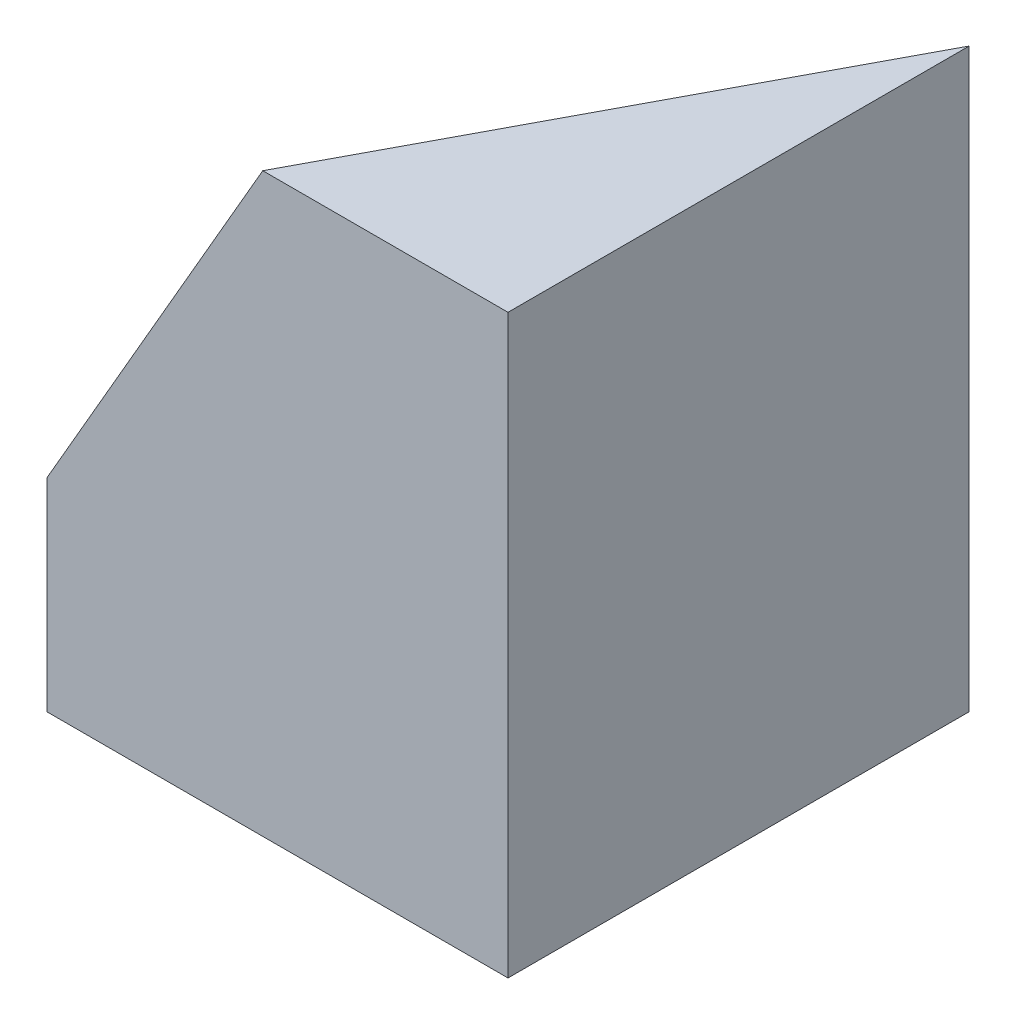
ISO-10303-21;
HEADER;
FILE_DESCRIPTION(('STEP AP214'),'2;1');
FILE_NAME('part.step','',(''),(''),'','','');
FILE_SCHEMA(('AUTOMOTIVE_DESIGN { 1 0 10303 214 1 1 1 1 }'));
ENDSEC;
DATA;
#1=APPLICATION_CONTEXT('core data for automotive mechanical design processes');
#2=APPLICATION_PROTOCOL_DEFINITION('international standard','automotive_design',2000,#1);
#3=PRODUCT_CONTEXT('',#1,'mechanical');
#4=PRODUCT('Part','Part','',(#3));
#5=PRODUCT_RELATED_PRODUCT_CATEGORY('part','',(#4));
#6=PRODUCT_DEFINITION_FORMATION('','',#4);
#7=PRODUCT_DEFINITION_CONTEXT('part definition',#1,'design');
#8=PRODUCT_DEFINITION('design','',#6,#7);
#9=PRODUCT_DEFINITION_SHAPE('','',#8);
#10=(LENGTH_UNIT() NAMED_UNIT(*) SI_UNIT(.MILLI.,.METRE.));
#11=(NAMED_UNIT(*) PLANE_ANGLE_UNIT() SI_UNIT($,.RADIAN.));
#12=(NAMED_UNIT(*) SI_UNIT($,.STERADIAN.) SOLID_ANGLE_UNIT());
#13=UNCERTAINTY_MEASURE_WITH_UNIT(LENGTH_MEASURE(1.E-05),#10,'distance_accuracy_value','');
#14=(GEOMETRIC_REPRESENTATION_CONTEXT(3) GLOBAL_UNCERTAINTY_ASSIGNED_CONTEXT((#13)) GLOBAL_UNIT_ASSIGNED_CONTEXT((#10,
#11,#12)) REPRESENTATION_CONTEXT('',''));
#15=CARTESIAN_POINT('',(0.,0.,0.));
#16=DIRECTION('',(0.,0.,1.));
#17=DIRECTION('',(1.,0.,0.));
#18=AXIS2_PLACEMENT_3D('',#15,#16,#17);
#19=CARTESIAN_POINT('',(24.,60.,24.));
#20=DIRECTION('',(-1.,0.,0.));
#21=DIRECTION('',(0.,0.,1.));
#22=AXIS2_PLACEMENT_3D('',#19,#20,#21);
#23=PLANE('',#22);
#24=DIRECTION('',(0.,0.,-1.));
#25=VECTOR('',#24,1.);
#26=CARTESIAN_POINT('',(24.,0.,24.));
#27=LINE('',#26,#25);
#28=CARTESIAN_POINT('',(24.,0.,24.));
#29=VERTEX_POINT('',#28);
#30=CARTESIAN_POINT('',(24.,0.,-24.));
#31=VERTEX_POINT('',#30);
#32=EDGE_CURVE('E104',#29,#31,#27,.T.);
#33=ORIENTED_EDGE('',*,*,#32,.T.);
#34=DIRECTION('',(0.,-1.,0.));
#35=VECTOR('',#34,1.);
#36=CARTESIAN_POINT('',(24.,60.,-24.));
#37=LINE('',#36,#35);
#38=CARTESIAN_POINT('',(24.,60.,-24.));
#39=VERTEX_POINT('',#38);
#40=EDGE_CURVE('E43',#39,#31,#37,.T.);
#41=ORIENTED_EDGE('',*,*,#40,.F.);
#42=DIRECTION('',(0.,0.,-1.));
#43=VECTOR('',#42,1.);
#44=CARTESIAN_POINT('',(24.,60.,24.));
#45=LINE('',#44,#43);
#46=CARTESIAN_POINT('',(24.,60.,24.));
#47=VERTEX_POINT('',#46);
#48=EDGE_CURVE('E105',#47,#39,#45,.T.);
#49=ORIENTED_EDGE('',*,*,#48,.F.);
#50=DIRECTION('',(0.,-1.,0.));
#51=VECTOR('',#50,1.);
#52=CARTESIAN_POINT('',(24.,60.,24.));
#53=LINE('',#52,#51);
#54=EDGE_CURVE('E109',#47,#29,#53,.T.);
#55=ORIENTED_EDGE('',*,*,#54,.T.);
#56=EDGE_LOOP('',(#33,#41,#49,#55));
#57=FACE_BOUND('',#56,.T.);
#58=ADVANCED_FACE('F36',(#57),#23,.F.);
#59=CARTESIAN_POINT('',(-24.,60.,-24.));
#60=DIRECTION('',(0.,0.,1.));
#61=DIRECTION('',(1.,0.,0.));
#62=AXIS2_PLACEMENT_3D('',#59,#60,#61);
#63=PLANE('',#62);
#64=DIRECTION('',(-1.,0.,0.));
#65=VECTOR('',#64,1.);
#66=CARTESIAN_POINT('',(-24.,0.,-24.));
#67=LINE('',#66,#65);
#68=CARTESIAN_POINT('',(-10.6410161513779,0.,-24.));
#69=VERTEX_POINT('',#68);
#70=EDGE_CURVE('E87',#31,#69,#67,.T.);
#71=ORIENTED_EDGE('',*,*,#70,.T.);
#72=DIRECTION('',(0.500000000000004,0.866025403784436,0.));
#73=VECTOR('',#72,1.);
#74=CARTESIAN_POINT('',(11.9999999999998,39.2153903091734,-24.));
#75=LINE('',#74,#73);
#76=EDGE_CURVE('E94',#69,#39,#75,.T.);
#77=ORIENTED_EDGE('',*,*,#76,.T.);
#78=ORIENTED_EDGE('',*,*,#40,.T.);
#79=EDGE_LOOP('',(#71,#77,#78));
#80=FACE_BOUND('',#79,.T.);
#81=ADVANCED_FACE('F117',(#80),#63,.F.);
#82=CARTESIAN_POINT('',(-24.,60.,24.));
#83=DIRECTION('',(1.,0.,0.));
#84=DIRECTION('',(0.,0.,-1.));
#85=AXIS2_PLACEMENT_3D('',#82,#83,#84);
#86=PLANE('',#85);
#87=DIRECTION('',(0.,-1.,0.));
#88=VECTOR('',#87,1.);
#89=CARTESIAN_POINT('',(-24.,60.,24.));
#90=LINE('',#89,#88);
#91=CARTESIAN_POINT('',(-24.,21.067053260755,24.));
#92=VERTEX_POINT('',#91);
#93=CARTESIAN_POINT('',(-24.,0.,24.));
#94=VERTEX_POINT('',#93);
#95=EDGE_CURVE('E92',#92,#94,#90,.T.);
#96=ORIENTED_EDGE('',*,*,#95,.F.);
#97=DIRECTION('',(0.,-0.677434014110465,-0.735583548297665));
#98=VECTOR('',#97,1.);
#99=CARTESIAN_POINT('',(-24.,38.9340382854635,43.4006500531479));
#100=LINE('',#99,#98);
#101=CARTESIAN_POINT('',(-24.,0.,1.12459447423744));
#102=VERTEX_POINT('',#101);
#103=EDGE_CURVE('E90',#92,#102,#100,.T.);
#104=ORIENTED_EDGE('',*,*,#103,.T.);
#105=DIRECTION('',(0.,0.,1.));
#106=VECTOR('',#105,1.);
#107=CARTESIAN_POINT('',(-24.,0.,24.));
#108=LINE('',#107,#106);
#109=EDGE_CURVE('E80',#102,#94,#108,.T.);
#110=ORIENTED_EDGE('',*,*,#109,.T.);
#111=EDGE_LOOP('',(#96,#104,#110));
#112=FACE_BOUND('',#111,.T.);
#113=ADVANCED_FACE('F91',(#112),#86,.F.);
#114=CARTESIAN_POINT('',(-24.,60.,24.));
#115=DIRECTION('',(0.,0.,-1.));
#116=DIRECTION('',(-1.,0.,0.));
#117=AXIS2_PLACEMENT_3D('',#114,#115,#116);
#118=PLANE('',#117);
#119=DIRECTION('',(1.,0.,0.));
#120=VECTOR('',#119,1.);
#121=CARTESIAN_POINT('',(-24.,60.,24.));
#122=LINE('',#121,#120);
#123=CARTESIAN_POINT('',(-1.5220527197513,60.,24.));
#124=VERTEX_POINT('',#123);
#125=EDGE_CURVE('E107',#124,#47,#122,.T.);
#126=ORIENTED_EDGE('',*,*,#125,.F.);
#127=DIRECTION('',(-0.500000000000004,-0.866025403784436,0.));
#128=VECTOR('',#127,1.);
#129=CARTESIAN_POINT('',(-7.14153953981356,50.2667633151886,24.));
#130=LINE('',#129,#128);
#131=EDGE_CURVE('E50',#124,#92,#130,.T.);
#132=ORIENTED_EDGE('',*,*,#131,.T.);
#133=ORIENTED_EDGE('',*,*,#95,.T.);
#134=DIRECTION('',(1.,0.,0.));
#135=VECTOR('',#134,1.);
#136=CARTESIAN_POINT('',(-24.,0.,24.));
#137=LINE('',#136,#135);
#138=EDGE_CURVE('E85',#94,#29,#137,.T.);
#139=ORIENTED_EDGE('',*,*,#138,.T.);
#140=ORIENTED_EDGE('',*,*,#54,.F.);
#141=EDGE_LOOP('',(#126,#132,#133,#139,#140));
#142=FACE_BOUND('',#141,.T.);
#143=ADVANCED_FACE('F121',(#142),#118,.F.);
#144=CARTESIAN_POINT('',(0.,60.,0.));
#145=DIRECTION('',(0.,-1.,0.));
#146=DIRECTION('',(0.,0.,-1.));
#147=AXIS2_PLACEMENT_3D('',#144,#145,#146);
#148=PLANE('',#147);
#149=ORIENTED_EDGE('',*,*,#48,.T.);
#150=DIRECTION('',(-0.469471562785895,0.,0.882947592858925));
#151=VECTOR('',#150,1.);
#152=CARTESIAN_POINT('',(8.76186397098829,60.,4.65876571230942));
#153=LINE('',#152,#151);
#154=EDGE_CURVE('E58',#39,#124,#153,.T.);
#155=ORIENTED_EDGE('',*,*,#154,.T.);
#156=ORIENTED_EDGE('',*,*,#125,.T.);
#157=EDGE_LOOP('',(#149,#155,#156));
#158=FACE_BOUND('',#157,.T.);
#159=ADVANCED_FACE('F122',(#158),#148,.F.);
#160=CARTESIAN_POINT('',(0.,0.,0.));
#161=DIRECTION('',(0.,-1.,0.));
#162=DIRECTION('',(0.,0.,-1.));
#163=AXIS2_PLACEMENT_3D('',#160,#161,#162);
#164=PLANE('',#163);
#165=DIRECTION('',(-0.469471562785895,0.,0.882947592858925));
#166=VECTOR('',#165,1.);
#167=CARTESIAN_POINT('',(-18.2441493051336,0.,-9.70058625817984));
#168=LINE('',#167,#166);
#169=EDGE_CURVE('E12',#69,#102,#168,.T.);
#170=ORIENTED_EDGE('',*,*,#169,.F.);
#171=ORIENTED_EDGE('',*,*,#70,.F.);
#172=ORIENTED_EDGE('',*,*,#32,.F.);
#173=ORIENTED_EDGE('',*,*,#138,.F.);
#174=ORIENTED_EDGE('',*,*,#109,.F.);
#175=EDGE_LOOP('',(#170,#171,#172,#173,#174));
#176=FACE_BOUND('',#175,.T.);
#177=ADVANCED_FACE('F82',(#176),#164,.T.);
#178=CARTESIAN_POINT('',(-14.481029552843,8.36062631047692,-7.69969999341532));
#179=DIRECTION('',(0.786634225220661,-0.454163481684926,0.41826083681755));
#180=DIRECTION('',(0.500000000000004,0.866025403784436,0.));
#181=AXIS2_PLACEMENT_3D('',#178,#179,#180);
#182=PLANE('',#181);
#183=ORIENTED_EDGE('',*,*,#131,.F.);
#184=ORIENTED_EDGE('',*,*,#154,.F.);
#185=ORIENTED_EDGE('',*,*,#76,.F.);
#186=ORIENTED_EDGE('',*,*,#169,.T.);
#187=ORIENTED_EDGE('',*,*,#103,.F.);
#188=EDGE_LOOP('',(#183,#184,#185,#186,#187));
#189=FACE_BOUND('',#188,.T.);
#190=ADVANCED_FACE('F97',(#189),#182,.F.);
#191=CLOSED_SHELL('',(#58,#81,#113,#143,#159,#177,#190));
#192=MANIFOLD_SOLID_BREP('B2',#191);
#193=ADVANCED_BREP_SHAPE_REPRESENTATION('',(#18,#192),#14);
#194=SHAPE_DEFINITION_REPRESENTATION(#9,#193);
ENDSEC;
END-ISO-10303-21;
